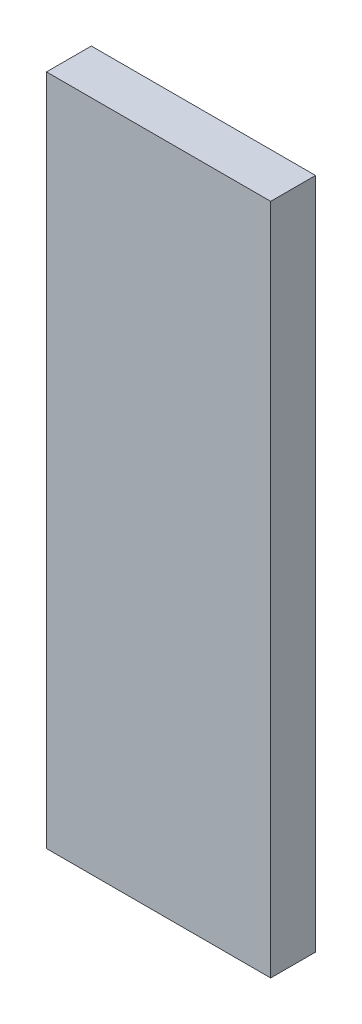
ISO-10303-21;
HEADER;
FILE_DESCRIPTION(('STEP AP214'),'2;1');
FILE_NAME('part.step','',(''),(''),'','','');
FILE_SCHEMA(('AUTOMOTIVE_DESIGN { 1 0 10303 214 1 1 1 1 }'));
ENDSEC;
DATA;
#1=APPLICATION_CONTEXT('core data for automotive mechanical design processes');
#2=APPLICATION_PROTOCOL_DEFINITION('international standard','automotive_design',2000,#1);
#3=PRODUCT_CONTEXT('',#1,'mechanical');
#4=PRODUCT('Part','Part','',(#3));
#5=PRODUCT_RELATED_PRODUCT_CATEGORY('part','',(#4));
#6=PRODUCT_DEFINITION_FORMATION('','',#4);
#7=PRODUCT_DEFINITION_CONTEXT('part definition',#1,'design');
#8=PRODUCT_DEFINITION('design','',#6,#7);
#9=PRODUCT_DEFINITION_SHAPE('','',#8);
#10=(LENGTH_UNIT() NAMED_UNIT(*) SI_UNIT(.MILLI.,.METRE.));
#11=(NAMED_UNIT(*) PLANE_ANGLE_UNIT() SI_UNIT($,.RADIAN.));
#12=(NAMED_UNIT(*) SI_UNIT($,.STERADIAN.) SOLID_ANGLE_UNIT());
#13=UNCERTAINTY_MEASURE_WITH_UNIT(LENGTH_MEASURE(1.E-05),#10,'distance_accuracy_value','');
#14=(GEOMETRIC_REPRESENTATION_CONTEXT(3) GLOBAL_UNCERTAINTY_ASSIGNED_CONTEXT((#13)) GLOBAL_UNIT_ASSIGNED_CONTEXT((#10,
#11,#12)) REPRESENTATION_CONTEXT('',''));
#15=CARTESIAN_POINT('',(0.,0.,0.));
#16=DIRECTION('',(0.,0.,1.));
#17=DIRECTION('',(1.,0.,0.));
#18=AXIS2_PLACEMENT_3D('',#15,#16,#17);
#19=CARTESIAN_POINT('',(-142.788961038961,167.987012987013,20.));
#20=DIRECTION('',(1.,0.,0.));
#21=DIRECTION('',(0.,1.,0.));
#22=AXIS2_PLACEMENT_3D('',#19,#20,#21);
#23=PLANE('',#22);
#24=DIRECTION('',(0.,-1.,0.));
#25=VECTOR('',#24,1.);
#26=CARTESIAN_POINT('',(-142.788961038961,167.987012987013,0.));
#27=LINE('',#26,#25);
#28=CARTESIAN_POINT('',(-142.788961038961,167.987012987013,0.));
#29=VERTEX_POINT('',#28);
#30=CARTESIAN_POINT('',(-142.788961038961,-132.012987012987,0.));
#31=VERTEX_POINT('',#30);
#32=EDGE_CURVE('E96',#29,#31,#27,.T.);
#33=ORIENTED_EDGE('',*,*,#32,.T.);
#34=DIRECTION('',(0.,0.,-1.));
#35=VECTOR('',#34,1.);
#36=CARTESIAN_POINT('',(-142.788961038961,-132.012987012987,20.));
#37=LINE('',#36,#35);
#38=CARTESIAN_POINT('',(-142.788961038961,-132.012987012987,20.));
#39=VERTEX_POINT('',#38);
#40=EDGE_CURVE('E11',#39,#31,#37,.T.);
#41=ORIENTED_EDGE('',*,*,#40,.F.);
#42=DIRECTION('',(0.,-1.,0.));
#43=VECTOR('',#42,1.);
#44=CARTESIAN_POINT('',(-142.788961038961,167.987012987013,20.));
#45=LINE('',#44,#43);
#46=CARTESIAN_POINT('',(-142.788961038961,167.987012987013,20.));
#47=VERTEX_POINT('',#46);
#48=EDGE_CURVE('E84',#47,#39,#45,.T.);
#49=ORIENTED_EDGE('',*,*,#48,.F.);
#50=DIRECTION('',(0.,0.,-1.));
#51=VECTOR('',#50,1.);
#52=CARTESIAN_POINT('',(-142.788961038961,167.987012987013,20.));
#53=LINE('',#52,#51);
#54=EDGE_CURVE('E92',#47,#29,#53,.T.);
#55=ORIENTED_EDGE('',*,*,#54,.T.);
#56=EDGE_LOOP('',(#33,#41,#49,#55));
#57=FACE_BOUND('',#56,.T.);
#58=ADVANCED_FACE('F33',(#57),#23,.F.);
#59=CARTESIAN_POINT('',(-142.788961038961,-132.012987012987,20.));
#60=DIRECTION('',(0.,1.,0.));
#61=DIRECTION('',(0.,0.,1.));
#62=AXIS2_PLACEMENT_3D('',#59,#60,#61);
#63=PLANE('',#62);
#64=DIRECTION('',(1.,0.,0.));
#65=VECTOR('',#64,1.);
#66=CARTESIAN_POINT('',(-142.788961038961,-132.012987012987,0.));
#67=LINE('',#66,#65);
#68=CARTESIAN_POINT('',(-42.7889610389611,-132.012987012987,0.));
#69=VERTEX_POINT('',#68);
#70=EDGE_CURVE('E88',#31,#69,#67,.T.);
#71=ORIENTED_EDGE('',*,*,#70,.T.);
#72=DIRECTION('',(0.,0.,-1.));
#73=VECTOR('',#72,1.);
#74=CARTESIAN_POINT('',(-42.7889610389611,-132.012987012987,20.));
#75=LINE('',#74,#73);
#76=CARTESIAN_POINT('',(-42.7889610389611,-132.012987012987,20.));
#77=VERTEX_POINT('',#76);
#78=EDGE_CURVE('E41',#77,#69,#75,.T.);
#79=ORIENTED_EDGE('',*,*,#78,.F.);
#80=DIRECTION('',(1.,0.,0.));
#81=VECTOR('',#80,1.);
#82=CARTESIAN_POINT('',(-142.788961038961,-132.012987012987,20.));
#83=LINE('',#82,#81);
#84=EDGE_CURVE('E79',#39,#77,#83,.T.);
#85=ORIENTED_EDGE('',*,*,#84,.F.);
#86=ORIENTED_EDGE('',*,*,#40,.T.);
#87=EDGE_LOOP('',(#71,#79,#85,#86));
#88=FACE_BOUND('',#87,.T.);
#89=ADVANCED_FACE('F87',(#88),#63,.F.);
#90=CARTESIAN_POINT('',(-42.7889610389611,167.987012987013,20.));
#91=DIRECTION('',(-1.,0.,0.));
#92=DIRECTION('',(0.,-1.,0.));
#93=AXIS2_PLACEMENT_3D('',#90,#91,#92);
#94=PLANE('',#93);
#95=DIRECTION('',(0.,1.,0.));
#96=VECTOR('',#95,1.);
#97=CARTESIAN_POINT('',(-42.7889610389611,167.987012987013,0.));
#98=LINE('',#97,#96);
#99=CARTESIAN_POINT('',(-42.7889610389611,167.987012987013,0.));
#100=VERTEX_POINT('',#99);
#101=EDGE_CURVE('E66',#69,#100,#98,.T.);
#102=ORIENTED_EDGE('',*,*,#101,.T.);
#103=DIRECTION('',(0.,0.,-1.));
#104=VECTOR('',#103,1.);
#105=CARTESIAN_POINT('',(-42.7889610389611,167.987012987013,20.));
#106=LINE('',#105,#104);
#107=CARTESIAN_POINT('',(-42.7889610389611,167.987012987013,20.));
#108=VERTEX_POINT('',#107);
#109=EDGE_CURVE('E89',#108,#100,#106,.T.);
#110=ORIENTED_EDGE('',*,*,#109,.F.);
#111=DIRECTION('',(0.,1.,0.));
#112=VECTOR('',#111,1.);
#113=CARTESIAN_POINT('',(-42.7889610389611,167.987012987013,20.));
#114=LINE('',#113,#112);
#115=EDGE_CURVE('E82',#77,#108,#114,.T.);
#116=ORIENTED_EDGE('',*,*,#115,.F.);
#117=ORIENTED_EDGE('',*,*,#78,.T.);
#118=EDGE_LOOP('',(#102,#110,#116,#117));
#119=FACE_BOUND('',#118,.T.);
#120=ADVANCED_FACE('F90',(#119),#94,.F.);
#121=CARTESIAN_POINT('',(-142.788961038961,167.987012987013,20.));
#122=DIRECTION('',(0.,-1.,0.));
#123=DIRECTION('',(0.,0.,-1.));
#124=AXIS2_PLACEMENT_3D('',#121,#122,#123);
#125=PLANE('',#124);
#126=DIRECTION('',(-1.,0.,0.));
#127=VECTOR('',#126,1.);
#128=CARTESIAN_POINT('',(-142.788961038961,167.987012987013,0.));
#129=LINE('',#128,#127);
#130=EDGE_CURVE('E72',#100,#29,#129,.T.);
#131=ORIENTED_EDGE('',*,*,#130,.T.);
#132=ORIENTED_EDGE('',*,*,#54,.F.);
#133=DIRECTION('',(-1.,0.,0.));
#134=VECTOR('',#133,1.);
#135=CARTESIAN_POINT('',(-142.788961038961,167.987012987013,20.));
#136=LINE('',#135,#134);
#137=EDGE_CURVE('E49',#108,#47,#136,.T.);
#138=ORIENTED_EDGE('',*,*,#137,.F.);
#139=ORIENTED_EDGE('',*,*,#109,.T.);
#140=EDGE_LOOP('',(#131,#132,#138,#139));
#141=FACE_BOUND('',#140,.T.);
#142=ADVANCED_FACE('F103',(#141),#125,.F.);
#143=CARTESIAN_POINT('',(0.,0.,20.));
#144=DIRECTION('',(0.,0.,1.));
#145=DIRECTION('',(1.,0.,0.));
#146=AXIS2_PLACEMENT_3D('',#143,#144,#145);
#147=PLANE('',#146);
#148=ORIENTED_EDGE('',*,*,#48,.T.);
#149=ORIENTED_EDGE('',*,*,#84,.T.);
#150=ORIENTED_EDGE('',*,*,#115,.T.);
#151=ORIENTED_EDGE('',*,*,#137,.T.);
#152=EDGE_LOOP('',(#148,#149,#150,#151));
#153=FACE_BOUND('',#152,.T.);
#154=ADVANCED_FACE('F80',(#153),#147,.T.);
#155=CARTESIAN_POINT('',(0.,0.,0.));
#156=DIRECTION('',(0.,0.,1.));
#157=DIRECTION('',(1.,0.,0.));
#158=AXIS2_PLACEMENT_3D('',#155,#156,#157);
#159=PLANE('',#158);
#160=ORIENTED_EDGE('',*,*,#32,.F.);
#161=ORIENTED_EDGE('',*,*,#130,.F.);
#162=ORIENTED_EDGE('',*,*,#101,.F.);
#163=ORIENTED_EDGE('',*,*,#70,.F.);
#164=EDGE_LOOP('',(#160,#161,#162,#163));
#165=FACE_BOUND('',#164,.T.);
#166=ADVANCED_FACE('F106',(#165),#159,.F.);
#167=CLOSED_SHELL('',(#58,#89,#120,#142,#154,#166));
#168=MANIFOLD_SOLID_BREP('B2',#167);
#169=ADVANCED_BREP_SHAPE_REPRESENTATION('',(#18,#168),#14);
#170=SHAPE_DEFINITION_REPRESENTATION(#9,#169);
ENDSEC;
END-ISO-10303-21;
